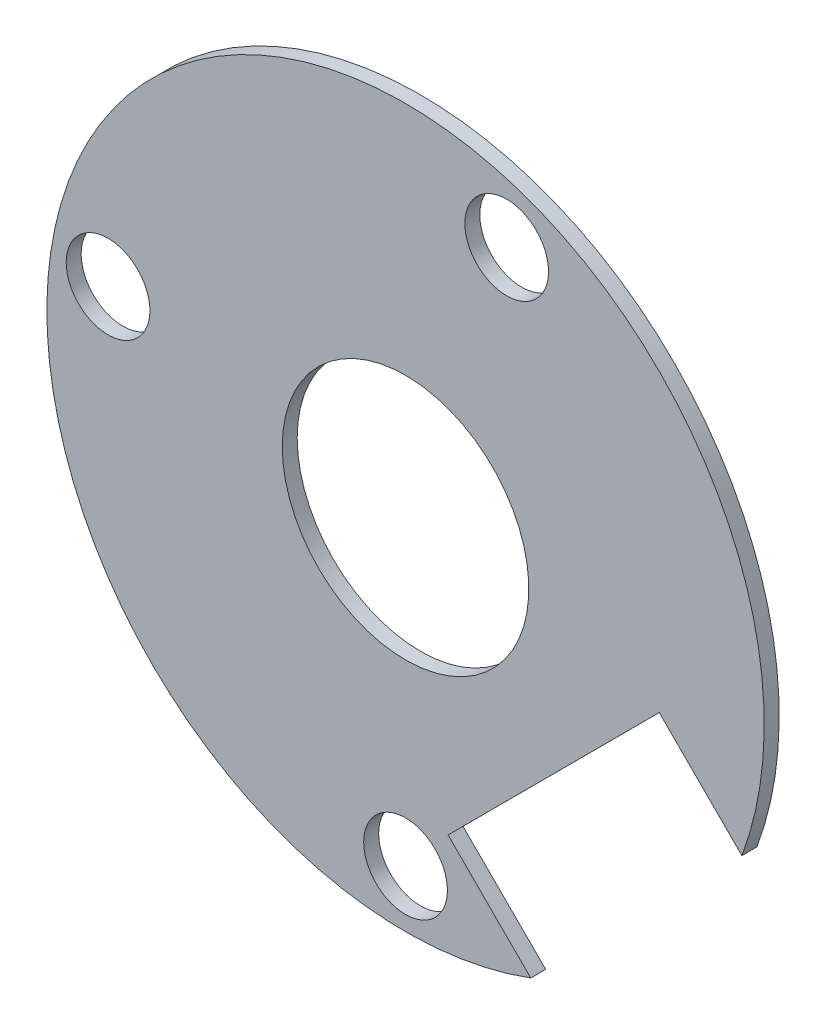
ISO-10303-21;
HEADER;
FILE_DESCRIPTION(('STEP AP214'),'2;1');
FILE_NAME('part.step','',(''),(''),'','','');
FILE_SCHEMA(('AUTOMOTIVE_DESIGN { 1 0 10303 214 1 1 1 1 }'));
ENDSEC;
DATA;
#1=APPLICATION_CONTEXT('core data for automotive mechanical design processes');
#2=APPLICATION_PROTOCOL_DEFINITION('international standard','automotive_design',2000,#1);
#3=PRODUCT_CONTEXT('',#1,'mechanical');
#4=PRODUCT('Part','Part','',(#3));
#5=PRODUCT_RELATED_PRODUCT_CATEGORY('part','',(#4));
#6=PRODUCT_DEFINITION_FORMATION('','',#4);
#7=PRODUCT_DEFINITION_CONTEXT('part definition',#1,'design');
#8=PRODUCT_DEFINITION('design','',#6,#7);
#9=PRODUCT_DEFINITION_SHAPE('','',#8);
#10=(LENGTH_UNIT() NAMED_UNIT(*) SI_UNIT(.MILLI.,.METRE.));
#11=(NAMED_UNIT(*) PLANE_ANGLE_UNIT() SI_UNIT($,.RADIAN.));
#12=(NAMED_UNIT(*) SI_UNIT($,.STERADIAN.) SOLID_ANGLE_UNIT());
#13=UNCERTAINTY_MEASURE_WITH_UNIT(LENGTH_MEASURE(1.E-05),#10,'distance_accuracy_value','');
#14=(GEOMETRIC_REPRESENTATION_CONTEXT(3) GLOBAL_UNCERTAINTY_ASSIGNED_CONTEXT((#13)) GLOBAL_UNIT_ASSIGNED_CONTEXT((#10,
#11,#12)) REPRESENTATION_CONTEXT('',''));
#15=CARTESIAN_POINT('',(0.,0.,0.));
#16=DIRECTION('',(0.,0.,1.));
#17=DIRECTION('',(1.,0.,0.));
#18=AXIS2_PLACEMENT_3D('',#15,#16,#17);
#19=CARTESIAN_POINT('',(0.,0.,76.));
#20=DIRECTION('',(0.,0.,1.));
#21=DIRECTION('',(0.,-1.,0.));
#22=AXIS2_PLACEMENT_3D('',#19,#20,#21);
#23=CYLINDRICAL_SURFACE('',#22,24.);
#24=DIRECTION('',(0.,0.,1.));
#25=VECTOR('',#24,1.);
#26=CARTESIAN_POINT('',(8.37808259667982,-22.4901696748426,76.));
#27=LINE('',#26,#25);
#28=CARTESIAN_POINT('',(8.37808259667982,-22.4901696748426,-108.));
#29=VERTEX_POINT('',#28);
#30=CARTESIAN_POINT('',(8.37808259667982,-22.4901696748426,-107.));
#31=VERTEX_POINT('',#30);
#32=EDGE_CURVE('E56',#29,#31,#27,.T.);
#33=ORIENTED_EDGE('',*,*,#32,.T.);
#34=CARTESIAN_POINT('',(0.,0.,-107.));
#35=DIRECTION('',(0.,0.,-1.));
#36=DIRECTION('',(-1.,0.,0.));
#37=AXIS2_PLACEMENT_3D('',#34,#35,#36);
#38=CIRCLE('',#37,24.);
#39=CARTESIAN_POINT('',(22.5064418611777,-8.33427109886813,-107.));
#40=VERTEX_POINT('',#39);
#41=EDGE_CURVE('E88',#31,#40,#38,.T.);
#42=ORIENTED_EDGE('',*,*,#41,.T.);
#43=DIRECTION('',(0.,0.,1.));
#44=VECTOR('',#43,1.);
#45=CARTESIAN_POINT('',(22.5064418611777,-8.33427109886813,76.));
#46=LINE('',#45,#44);
#47=CARTESIAN_POINT('',(22.5064418611777,-8.33427109886813,-108.));
#48=VERTEX_POINT('',#47);
#49=EDGE_CURVE('E87',#40,#48,#46,.F.);
#50=ORIENTED_EDGE('',*,*,#49,.T.);
#51=CARTESIAN_POINT('',(0.,0.,-108.));
#52=DIRECTION('',(0.,0.,1.));
#53=DIRECTION('',(0.,-1.,0.));
#54=AXIS2_PLACEMENT_3D('',#51,#52,#53);
#55=CIRCLE('',#54,24.);
#56=EDGE_CURVE('E41',#48,#29,#55,.T.);
#57=ORIENTED_EDGE('',*,*,#56,.T.);
#58=EDGE_LOOP('',(#33,#42,#50,#57));
#59=FACE_BOUND('',#58,.T.);
#60=ADVANCED_FACE('F33',(#59),#23,.T.);
#61=CARTESIAN_POINT('',(0.,24.,-108.));
#62=DIRECTION('',(0.,0.,1.));
#63=DIRECTION('',(0.,-1.,0.));
#64=AXIS2_PLACEMENT_3D('',#61,#62,#63);
#65=PLANE('',#64);
#66=CARTESIAN_POINT('',(0.,0.,-108.));
#67=DIRECTION('',(0.,0.,1.));
#68=DIRECTION('',(0.,-1.,0.));
#69=AXIS2_PLACEMENT_3D('',#66,#67,#68);
#70=CIRCLE('',#69,8.25000000000001);
#71=CARTESIAN_POINT('',(0.,-8.25,-108.));
#72=VERTEX_POINT('',#71);
#73=EDGE_CURVE('E113',#72,#72,#70,.T.);
#74=ORIENTED_EDGE('',*,*,#73,.T.);
#75=EDGE_LOOP('',(#74));
#76=FACE_BOUND('',#75,.T.);
#77=CARTESIAN_POINT('',(6.76785942282004,19.0325005932732,-108.));
#78=DIRECTION('',(0.,0.,1.));
#79=DIRECTION('',(1.,0.,0.));
#80=AXIS2_PLACEMENT_3D('',#77,#78,#79);
#81=CIRCLE('',#80,2.80000000000006);
#82=CARTESIAN_POINT('',(3.96785942281998,19.0325005932732,-108.));
#83=VERTEX_POINT('',#82);
#84=EDGE_CURVE('E104',#83,#83,#81,.T.);
#85=ORIENTED_EDGE('',*,*,#84,.T.);
#86=EDGE_LOOP('',(#85));
#87=FACE_BOUND('',#86,.T.);
#88=CARTESIAN_POINT('',(-19.9059854313234,3.43391089108909,-108.));
#89=DIRECTION('',(0.,0.,1.));
#90=DIRECTION('',(1.,0.,0.));
#91=AXIS2_PLACEMENT_3D('',#88,#89,#90);
#92=CIRCLE('',#91,2.80000000000001);
#93=CARTESIAN_POINT('',(-22.7059854313234,3.43391089108909,-108.));
#94=VERTEX_POINT('',#93);
#95=EDGE_CURVE('E107',#94,#94,#92,.T.);
#96=ORIENTED_EDGE('',*,*,#95,.T.);
#97=EDGE_LOOP('',(#96));
#98=FACE_BOUND('',#97,.T.);
#99=CARTESIAN_POINT('',(0.,-20.2,-108.));
#100=DIRECTION('',(0.,0.,1.));
#101=DIRECTION('',(1.,0.,0.));
#102=AXIS2_PLACEMENT_3D('',#99,#100,#101);
#103=CIRCLE('',#102,2.8);
#104=CARTESIAN_POINT('',(-2.8,-20.2,-108.));
#105=VERTEX_POINT('',#104);
#106=EDGE_CURVE('E103',#105,#105,#103,.T.);
#107=ORIENTED_EDGE('',*,*,#106,.T.);
#108=EDGE_LOOP('',(#107));
#109=FACE_BOUND('',#108,.T.);
#110=ORIENTED_EDGE('',*,*,#56,.F.);
#111=DIRECTION('',(0.707794928798725,-0.706417963224895,0.));
#112=VECTOR('',#111,1.);
#113=CARTESIAN_POINT('',(22.5064418611777,-8.33427109886812,-108.));
#114=LINE('',#113,#112);
#115=CARTESIAN_POINT('',(16.9733086354311,-2.81190219716126,-108.));
#116=VERTEX_POINT('',#115);
#117=EDGE_CURVE('E97',#116,#48,#114,.T.);
#118=ORIENTED_EDGE('',*,*,#117,.F.);
#119=DIRECTION('',(0.706417963224894,0.707794928798725,0.));
#120=VECTOR('',#119,1.);
#121=CARTESIAN_POINT('',(16.9733086354311,-2.81190219716126,-108.));
#122=LINE('',#121,#120);
#123=CARTESIAN_POINT('',(2.84494937093321,-16.9678007731358,-108.));
#124=VERTEX_POINT('',#123);
#125=EDGE_CURVE('E92',#124,#116,#122,.T.);
#126=ORIENTED_EDGE('',*,*,#125,.F.);
#127=DIRECTION('',(0.707794928798726,-0.706417963224893,0.));
#128=VECTOR('',#127,1.);
#129=CARTESIAN_POINT('',(-19.0641568798386,4.8986828424161,-108.));
#130=LINE('',#129,#128);
#131=EDGE_CURVE('E11',#124,#29,#130,.T.);
#132=ORIENTED_EDGE('',*,*,#131,.T.);
#133=EDGE_LOOP('',(#110,#118,#126,#132));
#134=FACE_BOUND('',#133,.T.);
#135=ADVANCED_FACE('F134',(#76,#87,#98,#109,#134),#65,.F.);
#136=CARTESIAN_POINT('',(0.,-20.2,-104.75));
#137=DIRECTION('',(0.,0.,-1.));
#138=DIRECTION('',(-1.,0.,0.));
#139=AXIS2_PLACEMENT_3D('',#136,#137,#138);
#140=CYLINDRICAL_SURFACE('',#139,2.8);
#141=CARTESIAN_POINT('',(0.,-20.2,-107.));
#142=DIRECTION('',(0.,0.,-1.));
#143=DIRECTION('',(-1.,0.,0.));
#144=AXIS2_PLACEMENT_3D('',#141,#142,#143);
#145=CIRCLE('',#144,2.8);
#146=CARTESIAN_POINT('',(-2.8,-20.2,-107.));
#147=VERTEX_POINT('',#146);
#148=EDGE_CURVE('E115',#147,#147,#145,.T.);
#149=CARTESIAN_POINT('',(-2.8,-20.2,-107.));
#150=CARTESIAN_POINT('',(-2.8,-20.2,-107.010416666667));
#151=CARTESIAN_POINT('',(-2.8,-20.2,-107.020833333333));
#152=CARTESIAN_POINT('',(-2.8,-20.2,-107.041666666667));
#153=CARTESIAN_POINT('',(-2.8,-20.2,-107.052083333333));
#154=CARTESIAN_POINT('',(-2.8,-20.2,-107.072916666667));
#155=CARTESIAN_POINT('',(-2.8,-20.2,-107.083333333333));
#156=CARTESIAN_POINT('',(-2.8,-20.2,-107.104166666667));
#157=CARTESIAN_POINT('',(-2.8,-20.2,-107.114583333333));
#158=CARTESIAN_POINT('',(-2.8,-20.2,-107.135416666667));
#159=CARTESIAN_POINT('',(-2.8,-20.2,-107.145833333333));
#160=CARTESIAN_POINT('',(-2.8,-20.2,-107.166666666667));
#161=CARTESIAN_POINT('',(-2.8,-20.2,-107.177083333333));
#162=CARTESIAN_POINT('',(-2.8,-20.2,-107.197916666667));
#163=CARTESIAN_POINT('',(-2.8,-20.2,-107.208333333333));
#164=CARTESIAN_POINT('',(-2.8,-20.2,-107.229166666667));
#165=CARTESIAN_POINT('',(-2.8,-20.2,-107.239583333333));
#166=CARTESIAN_POINT('',(-2.8,-20.2,-107.260416666667));
#167=CARTESIAN_POINT('',(-2.8,-20.2,-107.270833333333));
#168=CARTESIAN_POINT('',(-2.8,-20.2,-107.291666666667));
#169=CARTESIAN_POINT('',(-2.8,-20.2,-107.302083333333));
#170=CARTESIAN_POINT('',(-2.8,-20.2,-107.322916666667));
#171=CARTESIAN_POINT('',(-2.8,-20.2,-107.333333333333));
#172=CARTESIAN_POINT('',(-2.8,-20.2,-107.354166666667));
#173=CARTESIAN_POINT('',(-2.8,-20.2,-107.364583333333));
#174=CARTESIAN_POINT('',(-2.8,-20.2,-107.385416666667));
#175=CARTESIAN_POINT('',(-2.8,-20.2,-107.395833333333));
#176=CARTESIAN_POINT('',(-2.8,-20.2,-107.416666666667));
#177=CARTESIAN_POINT('',(-2.8,-20.2,-107.427083333333));
#178=CARTESIAN_POINT('',(-2.8,-20.2,-107.447916666667));
#179=CARTESIAN_POINT('',(-2.8,-20.2,-107.458333333333));
#180=CARTESIAN_POINT('',(-2.8,-20.2,-107.479166666667));
#181=CARTESIAN_POINT('',(-2.8,-20.2,-107.489583333333));
#182=CARTESIAN_POINT('',(-2.8,-20.2,-107.510416666667));
#183=CARTESIAN_POINT('',(-2.8,-20.2,-107.520833333333));
#184=CARTESIAN_POINT('',(-2.8,-20.2,-107.541666666667));
#185=CARTESIAN_POINT('',(-2.8,-20.2,-107.552083333333));
#186=CARTESIAN_POINT('',(-2.8,-20.2,-107.572916666667));
#187=CARTESIAN_POINT('',(-2.8,-20.2,-107.583333333333));
#188=CARTESIAN_POINT('',(-2.8,-20.2,-107.604166666667));
#189=CARTESIAN_POINT('',(-2.8,-20.2,-107.614583333333));
#190=CARTESIAN_POINT('',(-2.8,-20.2,-107.635416666667));
#191=CARTESIAN_POINT('',(-2.8,-20.2,-107.645833333333));
#192=CARTESIAN_POINT('',(-2.8,-20.2,-107.666666666667));
#193=CARTESIAN_POINT('',(-2.8,-20.2,-107.677083333333));
#194=CARTESIAN_POINT('',(-2.8,-20.2,-107.697916666667));
#195=CARTESIAN_POINT('',(-2.8,-20.2,-107.708333333333));
#196=CARTESIAN_POINT('',(-2.8,-20.2,-107.729166666667));
#197=CARTESIAN_POINT('',(-2.8,-20.2,-107.739583333333));
#198=CARTESIAN_POINT('',(-2.8,-20.2,-107.760416666667));
#199=CARTESIAN_POINT('',(-2.8,-20.2,-107.770833333333));
#200=CARTESIAN_POINT('',(-2.8,-20.2,-107.791666666667));
#201=CARTESIAN_POINT('',(-2.8,-20.2,-107.802083333333));
#202=CARTESIAN_POINT('',(-2.8,-20.2,-107.822916666667));
#203=CARTESIAN_POINT('',(-2.8,-20.2,-107.833333333333));
#204=CARTESIAN_POINT('',(-2.8,-20.2,-107.854166666667));
#205=CARTESIAN_POINT('',(-2.8,-20.2,-107.864583333333));
#206=CARTESIAN_POINT('',(-2.8,-20.2,-107.885416666667));
#207=CARTESIAN_POINT('',(-2.8,-20.2,-107.895833333333));
#208=CARTESIAN_POINT('',(-2.8,-20.2,-107.916666666667));
#209=CARTESIAN_POINT('',(-2.8,-20.2,-107.927083333333));
#210=CARTESIAN_POINT('',(-2.8,-20.2,-107.947916666667));
#211=CARTESIAN_POINT('',(-2.8,-20.2,-107.958333333333));
#212=CARTESIAN_POINT('',(-2.8,-20.2,-107.979166666667));
#213=CARTESIAN_POINT('',(-2.8,-20.2,-107.989583333333));
#214=CARTESIAN_POINT('',(-2.8,-20.2,-108.));
#215=B_SPLINE_CURVE_WITH_KNOTS('',3,(#149,#150,#151,#152,#153,#154,#155,#156,#157,#158,#159,
#160,#161,#162,#163,#164,#165,#166,#167,#168,#169,#170,#171,#172,#173,#174,#175,#176,#177,#178,
#179,#180,#181,#182,#183,#184,#185,#186,#187,#188,#189,#190,#191,#192,#193,#194,#195,#196,#197,
#198,#199,#200,#201,#202,#203,#204,#205,#206,#207,#208,#209,#210,#211,#212,#213,#214),
.UNSPECIFIED.,.F.,.F.,(4,2,2,2,2,2,2,2,2,2,2,2,2,2,2,2,2,2,2,2,2,2,2,2,2,2,2,2,2,2,2,2,4),(0.,
0.0312500000000104,0.062500000000007,0.0937500000000174,0.125000000000014,0.156250000000011,
0.187500000000021,0.218750000000018,0.250000000000014,0.281250000000025,0.312500000000021,
0.343750000000018,0.375000000000028,0.406250000000025,0.437500000000021,0.468750000000032,
0.500000000000028,0.531250000000025,0.562500000000035,0.593750000000032,0.625000000000028,
0.656250000000039,0.687500000000035,0.718750000000032,0.750000000000042,0.781250000000039,
0.812500000000035,0.843750000000046,0.875000000000042,0.906250000000039,0.937500000000049,
0.968750000000046,1.00000000000006),.UNSPECIFIED.);
#216=EDGE_CURVE('BSEAM136',#147,#105,#215,.T.);
#217=ORIENTED_EDGE('',*,*,#148,.F.);
#218=ORIENTED_EDGE('',*,*,#106,.F.);
#219=ORIENTED_EDGE('',*,*,#216,.T.);
#220=ORIENTED_EDGE('',*,*,#216,.F.);
#221=EDGE_LOOP('',(#217,#219,#218,#220));
#222=FACE_BOUND('',#221,.T.);
#223=ADVANCED_FACE('F136',(#222),#140,.F.);
#224=CARTESIAN_POINT('',(-19.9059854313234,3.43391089108909,-104.75));
#225=DIRECTION('',(0.,0.,-1.));
#226=DIRECTION('',(-1.,0.,0.));
#227=AXIS2_PLACEMENT_3D('',#224,#225,#226);
#228=CYLINDRICAL_SURFACE('',#227,2.80000000000001);
#229=CARTESIAN_POINT('',(-19.9059854313234,3.43391089108909,-107.));
#230=DIRECTION('',(0.,0.,-1.));
#231=DIRECTION('',(-1.,0.,0.));
#232=AXIS2_PLACEMENT_3D('',#229,#230,#231);
#233=CIRCLE('',#232,2.80000000000001);
#234=CARTESIAN_POINT('',(-22.7059854313234,3.43391089108909,-107.));
#235=VERTEX_POINT('',#234);
#236=EDGE_CURVE('E119',#235,#235,#233,.T.);
#237=CARTESIAN_POINT('',(-22.7059854313234,3.43391089108909,-107.));
#238=CARTESIAN_POINT('',(-22.7059854313234,3.43391089108909,-107.010416666667));
#239=CARTESIAN_POINT('',(-22.7059854313234,3.43391089108909,-107.020833333333));
#240=CARTESIAN_POINT('',(-22.7059854313234,3.43391089108909,-107.041666666667));
#241=CARTESIAN_POINT('',(-22.7059854313234,3.43391089108909,-107.052083333333));
#242=CARTESIAN_POINT('',(-22.7059854313234,3.43391089108909,-107.072916666667));
#243=CARTESIAN_POINT('',(-22.7059854313234,3.43391089108909,-107.083333333333));
#244=CARTESIAN_POINT('',(-22.7059854313234,3.43391089108909,-107.104166666667));
#245=CARTESIAN_POINT('',(-22.7059854313234,3.43391089108909,-107.114583333333));
#246=CARTESIAN_POINT('',(-22.7059854313234,3.43391089108909,-107.135416666667));
#247=CARTESIAN_POINT('',(-22.7059854313234,3.43391089108909,-107.145833333333));
#248=CARTESIAN_POINT('',(-22.7059854313234,3.43391089108909,-107.166666666667));
#249=CARTESIAN_POINT('',(-22.7059854313234,3.43391089108909,-107.177083333333));
#250=CARTESIAN_POINT('',(-22.7059854313234,3.43391089108909,-107.197916666667));
#251=CARTESIAN_POINT('',(-22.7059854313234,3.43391089108909,-107.208333333333));
#252=CARTESIAN_POINT('',(-22.7059854313234,3.43391089108909,-107.229166666667));
#253=CARTESIAN_POINT('',(-22.7059854313234,3.43391089108909,-107.239583333333));
#254=CARTESIAN_POINT('',(-22.7059854313234,3.43391089108909,-107.260416666667));
#255=CARTESIAN_POINT('',(-22.7059854313234,3.43391089108909,-107.270833333333));
#256=CARTESIAN_POINT('',(-22.7059854313234,3.43391089108909,-107.291666666667));
#257=CARTESIAN_POINT('',(-22.7059854313234,3.43391089108909,-107.302083333333));
#258=CARTESIAN_POINT('',(-22.7059854313234,3.43391089108909,-107.322916666667));
#259=CARTESIAN_POINT('',(-22.7059854313234,3.43391089108909,-107.333333333333));
#260=CARTESIAN_POINT('',(-22.7059854313234,3.43391089108909,-107.354166666667));
#261=CARTESIAN_POINT('',(-22.7059854313234,3.43391089108909,-107.364583333333));
#262=CARTESIAN_POINT('',(-22.7059854313234,3.43391089108909,-107.385416666667));
#263=CARTESIAN_POINT('',(-22.7059854313234,3.43391089108909,-107.395833333333));
#264=CARTESIAN_POINT('',(-22.7059854313234,3.43391089108909,-107.416666666667));
#265=CARTESIAN_POINT('',(-22.7059854313234,3.43391089108909,-107.427083333333));
#266=CARTESIAN_POINT('',(-22.7059854313234,3.43391089108909,-107.447916666667));
#267=CARTESIAN_POINT('',(-22.7059854313234,3.43391089108909,-107.458333333333));
#268=CARTESIAN_POINT('',(-22.7059854313234,3.43391089108909,-107.479166666667));
#269=CARTESIAN_POINT('',(-22.7059854313234,3.43391089108909,-107.489583333333));
#270=CARTESIAN_POINT('',(-22.7059854313234,3.43391089108909,-107.510416666667));
#271=CARTESIAN_POINT('',(-22.7059854313234,3.43391089108909,-107.520833333333));
#272=CARTESIAN_POINT('',(-22.7059854313234,3.43391089108909,-107.541666666667));
#273=CARTESIAN_POINT('',(-22.7059854313234,3.43391089108909,-107.552083333333));
#274=CARTESIAN_POINT('',(-22.7059854313234,3.43391089108909,-107.572916666667));
#275=CARTESIAN_POINT('',(-22.7059854313234,3.43391089108909,-107.583333333333));
#276=CARTESIAN_POINT('',(-22.7059854313234,3.43391089108909,-107.604166666667));
#277=CARTESIAN_POINT('',(-22.7059854313234,3.43391089108909,-107.614583333333));
#278=CARTESIAN_POINT('',(-22.7059854313234,3.43391089108909,-107.635416666667));
#279=CARTESIAN_POINT('',(-22.7059854313234,3.43391089108909,-107.645833333333));
#280=CARTESIAN_POINT('',(-22.7059854313234,3.43391089108909,-107.666666666667));
#281=CARTESIAN_POINT('',(-22.7059854313234,3.43391089108909,-107.677083333333));
#282=CARTESIAN_POINT('',(-22.7059854313234,3.43391089108909,-107.697916666667));
#283=CARTESIAN_POINT('',(-22.7059854313234,3.43391089108909,-107.708333333333));
#284=CARTESIAN_POINT('',(-22.7059854313234,3.43391089108909,-107.729166666667));
#285=CARTESIAN_POINT('',(-22.7059854313234,3.43391089108909,-107.739583333333));
#286=CARTESIAN_POINT('',(-22.7059854313234,3.43391089108909,-107.760416666667));
#287=CARTESIAN_POINT('',(-22.7059854313234,3.43391089108909,-107.770833333333));
#288=CARTESIAN_POINT('',(-22.7059854313234,3.43391089108909,-107.791666666667));
#289=CARTESIAN_POINT('',(-22.7059854313234,3.43391089108909,-107.802083333333));
#290=CARTESIAN_POINT('',(-22.7059854313234,3.43391089108909,-107.822916666667));
#291=CARTESIAN_POINT('',(-22.7059854313234,3.43391089108909,-107.833333333333));
#292=CARTESIAN_POINT('',(-22.7059854313234,3.43391089108909,-107.854166666667));
#293=CARTESIAN_POINT('',(-22.7059854313234,3.43391089108909,-107.864583333333));
#294=CARTESIAN_POINT('',(-22.7059854313234,3.43391089108909,-107.885416666667));
#295=CARTESIAN_POINT('',(-22.7059854313234,3.43391089108909,-107.895833333333));
#296=CARTESIAN_POINT('',(-22.7059854313234,3.43391089108909,-107.916666666667));
#297=CARTESIAN_POINT('',(-22.7059854313234,3.43391089108909,-107.927083333333));
#298=CARTESIAN_POINT('',(-22.7059854313234,3.43391089108909,-107.947916666667));
#299=CARTESIAN_POINT('',(-22.7059854313234,3.43391089108909,-107.958333333333));
#300=CARTESIAN_POINT('',(-22.7059854313234,3.43391089108909,-107.979166666667));
#301=CARTESIAN_POINT('',(-22.7059854313234,3.43391089108909,-107.989583333333));
#302=CARTESIAN_POINT('',(-22.7059854313234,3.43391089108909,-108.));
#303=B_SPLINE_CURVE_WITH_KNOTS('',3,(#237,#238,#239,#240,#241,#242,#243,#244,#245,#246,#247,
#248,#249,#250,#251,#252,#253,#254,#255,#256,#257,#258,#259,#260,#261,#262,#263,#264,#265,#266,
#267,#268,#269,#270,#271,#272,#273,#274,#275,#276,#277,#278,#279,#280,#281,#282,#283,#284,#285,
#286,#287,#288,#289,#290,#291,#292,#293,#294,#295,#296,#297,#298,#299,#300,#301,#302),
.UNSPECIFIED.,.F.,.F.,(4,2,2,2,2,2,2,2,2,2,2,2,2,2,2,2,2,2,2,2,2,2,2,2,2,2,2,2,2,2,2,2,4),(0.,
0.0312499999999966,0.0624999999999931,0.0937500000000036,0.125,0.156249999999997,
0.187500000000007,0.218750000000004,0.250000000000014,0.281250000000011,0.312500000000007,
0.343750000000018,0.375000000000014,0.406250000000011,0.437500000000021,0.468750000000018,
0.500000000000028,0.531250000000025,0.562500000000021,0.593750000000032,0.625000000000028,
0.656250000000025,0.687500000000035,0.718750000000032,0.750000000000042,0.781250000000039,
0.812500000000035,0.843750000000046,0.875000000000042,0.906250000000039,0.937500000000049,
0.968750000000046,1.00000000000006),.UNSPECIFIED.);
#304=EDGE_CURVE('BSEAM141',#235,#94,#303,.T.);
#305=ORIENTED_EDGE('',*,*,#236,.F.);
#306=ORIENTED_EDGE('',*,*,#95,.F.);
#307=ORIENTED_EDGE('',*,*,#304,.T.);
#308=ORIENTED_EDGE('',*,*,#304,.F.);
#309=EDGE_LOOP('',(#305,#307,#306,#308));
#310=FACE_BOUND('',#309,.T.);
#311=ADVANCED_FACE('F141',(#310),#228,.F.);
#312=CARTESIAN_POINT('',(6.76785942282004,19.0325005932732,-104.75));
#313=DIRECTION('',(0.,0.,-1.));
#314=DIRECTION('',(-1.,0.,0.));
#315=AXIS2_PLACEMENT_3D('',#312,#313,#314);
#316=CYLINDRICAL_SURFACE('',#315,2.80000000000006);
#317=CARTESIAN_POINT('',(6.76785942282004,19.0325005932732,-107.));
#318=DIRECTION('',(0.,0.,-1.));
#319=DIRECTION('',(-1.,0.,0.));
#320=AXIS2_PLACEMENT_3D('',#317,#318,#319);
#321=CIRCLE('',#320,2.80000000000006);
#322=CARTESIAN_POINT('',(3.96785942281998,19.0325005932732,-107.));
#323=VERTEX_POINT('',#322);
#324=EDGE_CURVE('E124',#323,#323,#321,.T.);
#325=CARTESIAN_POINT('',(3.96785942281998,19.0325005932732,-107.));
#326=CARTESIAN_POINT('',(3.96785942281998,19.0325005932732,-107.010416666667));
#327=CARTESIAN_POINT('',(3.96785942281998,19.0325005932732,-107.020833333333));
#328=CARTESIAN_POINT('',(3.96785942281998,19.0325005932732,-107.041666666667));
#329=CARTESIAN_POINT('',(3.96785942281998,19.0325005932732,-107.052083333333));
#330=CARTESIAN_POINT('',(3.96785942281998,19.0325005932732,-107.072916666667));
#331=CARTESIAN_POINT('',(3.96785942281998,19.0325005932732,-107.083333333333));
#332=CARTESIAN_POINT('',(3.96785942281998,19.0325005932732,-107.104166666667));
#333=CARTESIAN_POINT('',(3.96785942281998,19.0325005932732,-107.114583333333));
#334=CARTESIAN_POINT('',(3.96785942281998,19.0325005932732,-107.135416666667));
#335=CARTESIAN_POINT('',(3.96785942281998,19.0325005932732,-107.145833333333));
#336=CARTESIAN_POINT('',(3.96785942281998,19.0325005932732,-107.166666666667));
#337=CARTESIAN_POINT('',(3.96785942281998,19.0325005932732,-107.177083333333));
#338=CARTESIAN_POINT('',(3.96785942281998,19.0325005932732,-107.197916666667));
#339=CARTESIAN_POINT('',(3.96785942281998,19.0325005932732,-107.208333333333));
#340=CARTESIAN_POINT('',(3.96785942281998,19.0325005932732,-107.229166666667));
#341=CARTESIAN_POINT('',(3.96785942281998,19.0325005932732,-107.239583333333));
#342=CARTESIAN_POINT('',(3.96785942281998,19.0325005932732,-107.260416666667));
#343=CARTESIAN_POINT('',(3.96785942281998,19.0325005932732,-107.270833333333));
#344=CARTESIAN_POINT('',(3.96785942281998,19.0325005932732,-107.291666666667));
#345=CARTESIAN_POINT('',(3.96785942281998,19.0325005932732,-107.302083333333));
#346=CARTESIAN_POINT('',(3.96785942281998,19.0325005932732,-107.322916666667));
#347=CARTESIAN_POINT('',(3.96785942281998,19.0325005932732,-107.333333333333));
#348=CARTESIAN_POINT('',(3.96785942281998,19.0325005932732,-107.354166666667));
#349=CARTESIAN_POINT('',(3.96785942281998,19.0325005932732,-107.364583333333));
#350=CARTESIAN_POINT('',(3.96785942281998,19.0325005932732,-107.385416666667));
#351=CARTESIAN_POINT('',(3.96785942281998,19.0325005932732,-107.395833333333));
#352=CARTESIAN_POINT('',(3.96785942281998,19.0325005932732,-107.416666666667));
#353=CARTESIAN_POINT('',(3.96785942281998,19.0325005932732,-107.427083333333));
#354=CARTESIAN_POINT('',(3.96785942281998,19.0325005932732,-107.447916666667));
#355=CARTESIAN_POINT('',(3.96785942281998,19.0325005932732,-107.458333333333));
#356=CARTESIAN_POINT('',(3.96785942281998,19.0325005932732,-107.479166666667));
#357=CARTESIAN_POINT('',(3.96785942281998,19.0325005932732,-107.489583333333));
#358=CARTESIAN_POINT('',(3.96785942281998,19.0325005932732,-107.510416666667));
#359=CARTESIAN_POINT('',(3.96785942281998,19.0325005932732,-107.520833333333));
#360=CARTESIAN_POINT('',(3.96785942281998,19.0325005932732,-107.541666666667));
#361=CARTESIAN_POINT('',(3.96785942281998,19.0325005932732,-107.552083333333));
#362=CARTESIAN_POINT('',(3.96785942281998,19.0325005932732,-107.572916666667));
#363=CARTESIAN_POINT('',(3.96785942281998,19.0325005932732,-107.583333333333));
#364=CARTESIAN_POINT('',(3.96785942281998,19.0325005932732,-107.604166666667));
#365=CARTESIAN_POINT('',(3.96785942281998,19.0325005932732,-107.614583333333));
#366=CARTESIAN_POINT('',(3.96785942281998,19.0325005932732,-107.635416666667));
#367=CARTESIAN_POINT('',(3.96785942281998,19.0325005932732,-107.645833333333));
#368=CARTESIAN_POINT('',(3.96785942281998,19.0325005932732,-107.666666666667));
#369=CARTESIAN_POINT('',(3.96785942281998,19.0325005932732,-107.677083333333));
#370=CARTESIAN_POINT('',(3.96785942281998,19.0325005932732,-107.697916666667));
#371=CARTESIAN_POINT('',(3.96785942281998,19.0325005932732,-107.708333333333));
#372=CARTESIAN_POINT('',(3.96785942281998,19.0325005932732,-107.729166666667));
#373=CARTESIAN_POINT('',(3.96785942281998,19.0325005932732,-107.739583333333));
#374=CARTESIAN_POINT('',(3.96785942281998,19.0325005932732,-107.760416666667));
#375=CARTESIAN_POINT('',(3.96785942281998,19.0325005932732,-107.770833333333));
#376=CARTESIAN_POINT('',(3.96785942281998,19.0325005932732,-107.791666666667));
#377=CARTESIAN_POINT('',(3.96785942281998,19.0325005932732,-107.802083333333));
#378=CARTESIAN_POINT('',(3.96785942281998,19.0325005932732,-107.822916666667));
#379=CARTESIAN_POINT('',(3.96785942281998,19.0325005932732,-107.833333333333));
#380=CARTESIAN_POINT('',(3.96785942281998,19.0325005932732,-107.854166666667));
#381=CARTESIAN_POINT('',(3.96785942281998,19.0325005932732,-107.864583333333));
#382=CARTESIAN_POINT('',(3.96785942281998,19.0325005932732,-107.885416666667));
#383=CARTESIAN_POINT('',(3.96785942281998,19.0325005932732,-107.895833333333));
#384=CARTESIAN_POINT('',(3.96785942281998,19.0325005932732,-107.916666666667));
#385=CARTESIAN_POINT('',(3.96785942281998,19.0325005932732,-107.927083333333));
#386=CARTESIAN_POINT('',(3.96785942281998,19.0325005932732,-107.947916666667));
#387=CARTESIAN_POINT('',(3.96785942281998,19.0325005932732,-107.958333333333));
#388=CARTESIAN_POINT('',(3.96785942281998,19.0325005932732,-107.979166666667));
#389=CARTESIAN_POINT('',(3.96785942281998,19.0325005932732,-107.989583333333));
#390=CARTESIAN_POINT('',(3.96785942281998,19.0325005932732,-108.));
#391=B_SPLINE_CURVE_WITH_KNOTS('',3,(#325,#326,#327,#328,#329,#330,#331,#332,#333,#334,#335,
#336,#337,#338,#339,#340,#341,#342,#343,#344,#345,#346,#347,#348,#349,#350,#351,#352,#353,#354,
#355,#356,#357,#358,#359,#360,#361,#362,#363,#364,#365,#366,#367,#368,#369,#370,#371,#372,#373,
#374,#375,#376,#377,#378,#379,#380,#381,#382,#383,#384,#385,#386,#387,#388,#389,#390),
.UNSPECIFIED.,.F.,.F.,(4,2,2,2,2,2,2,2,2,2,2,2,2,2,2,2,2,2,2,2,2,2,2,2,2,2,2,2,2,2,2,2,4),(0.,
0.0312500000000104,0.062500000000007,0.0937500000000174,0.125000000000014,0.156250000000011,
0.187500000000021,0.218750000000018,0.250000000000014,0.281250000000025,0.312500000000021,
0.343750000000018,0.375000000000028,0.406250000000025,0.437500000000021,0.468750000000032,
0.500000000000028,0.531250000000025,0.562500000000035,0.593750000000032,0.625000000000028,
0.656250000000039,0.687500000000035,0.718750000000032,0.750000000000042,0.781250000000039,
0.812500000000035,0.843750000000046,0.875000000000042,0.906250000000039,0.937500000000049,
0.968750000000046,1.00000000000006),.UNSPECIFIED.);
#392=EDGE_CURVE('BSEAM148',#323,#83,#391,.T.);
#393=ORIENTED_EDGE('',*,*,#324,.F.);
#394=ORIENTED_EDGE('',*,*,#84,.F.);
#395=ORIENTED_EDGE('',*,*,#392,.T.);
#396=ORIENTED_EDGE('',*,*,#392,.F.);
#397=EDGE_LOOP('',(#393,#395,#394,#396));
#398=FACE_BOUND('',#397,.T.);
#399=ADVANCED_FACE('F148',(#398),#316,.F.);
#400=CARTESIAN_POINT('',(22.5064418611777,-8.33427109886812,-106.));
#401=DIRECTION('',(0.706417963224895,0.707794928798725,0.));
#402=DIRECTION('',(-0.707794928798725,0.706417963224895,0.));
#403=AXIS2_PLACEMENT_3D('',#400,#401,#402);
#404=PLANE('',#403);
#405=ORIENTED_EDGE('',*,*,#49,.F.);
#406=DIRECTION('',(-0.707794928798725,0.706417963224895,0.));
#407=VECTOR('',#406,1.);
#408=CARTESIAN_POINT('',(22.5064418611777,-8.33427109886812,-107.));
#409=LINE('',#408,#407);
#410=CARTESIAN_POINT('',(16.9733086354311,-2.81190219716126,-107.));
#411=VERTEX_POINT('',#410);
#412=EDGE_CURVE('E75',#40,#411,#409,.T.);
#413=ORIENTED_EDGE('',*,*,#412,.T.);
#414=DIRECTION('',(0.,0.,-1.));
#415=VECTOR('',#414,1.);
#416=CARTESIAN_POINT('',(16.9733086354311,-2.81190219716126,-106.));
#417=LINE('',#416,#415);
#418=EDGE_CURVE('E85',#411,#116,#417,.T.);
#419=ORIENTED_EDGE('',*,*,#418,.T.);
#420=ORIENTED_EDGE('',*,*,#117,.T.);
#421=EDGE_LOOP('',(#405,#413,#419,#420));
#422=FACE_BOUND('',#421,.T.);
#423=ADVANCED_FACE('F83',(#422),#404,.F.);
#424=CARTESIAN_POINT('',(2.84494937093321,-16.9678007731358,-106.));
#425=DIRECTION('',(-0.706417963224893,-0.707794928798726,0.));
#426=DIRECTION('',(0.707794928798726,-0.706417963224893,0.));
#427=AXIS2_PLACEMENT_3D('',#424,#425,#426);
#428=PLANE('',#427);
#429=DIRECTION('',(0.,0.,-1.));
#430=VECTOR('',#429,1.);
#431=CARTESIAN_POINT('',(2.84494937093321,-16.9678007731358,-106.));
#432=LINE('',#431,#430);
#433=CARTESIAN_POINT('',(2.84494937093321,-16.9678007731358,-107.));
#434=VERTEX_POINT('',#433);
#435=EDGE_CURVE('E94',#434,#124,#432,.T.);
#436=ORIENTED_EDGE('',*,*,#435,.F.);
#437=DIRECTION('',(0.707794928798726,-0.706417963224893,0.));
#438=VECTOR('',#437,1.);
#439=CARTESIAN_POINT('',(2.84494937093321,-16.9678007731358,-107.));
#440=LINE('',#439,#438);
#441=EDGE_CURVE('E49',#434,#31,#440,.T.);
#442=ORIENTED_EDGE('',*,*,#441,.T.);
#443=ORIENTED_EDGE('',*,*,#32,.F.);
#444=ORIENTED_EDGE('',*,*,#131,.F.);
#445=EDGE_LOOP('',(#436,#442,#443,#444));
#446=FACE_BOUND('',#445,.T.);
#447=ADVANCED_FACE('F130',(#446),#428,.F.);
#448=CARTESIAN_POINT('',(16.9733086354311,-2.81190219716126,-106.));
#449=DIRECTION('',(-0.707794928798725,0.706417963224894,0.));
#450=DIRECTION('',(-0.706417963224894,-0.707794928798725,0.));
#451=AXIS2_PLACEMENT_3D('',#448,#449,#450);
#452=PLANE('',#451);
#453=ORIENTED_EDGE('',*,*,#418,.F.);
#454=DIRECTION('',(-0.706417963224894,-0.707794928798725,0.));
#455=VECTOR('',#454,1.);
#456=CARTESIAN_POINT('',(16.9733086354311,-2.81190219716126,-107.));
#457=LINE('',#456,#455);
#458=EDGE_CURVE('E72',#411,#434,#457,.T.);
#459=ORIENTED_EDGE('',*,*,#458,.T.);
#460=ORIENTED_EDGE('',*,*,#435,.T.);
#461=ORIENTED_EDGE('',*,*,#125,.T.);
#462=EDGE_LOOP('',(#453,#459,#460,#461));
#463=FACE_BOUND('',#462,.T.);
#464=ADVANCED_FACE('F90',(#463),#452,.F.);
#465=CARTESIAN_POINT('',(0.,0.,76.));
#466=DIRECTION('',(0.,0.,-1.));
#467=DIRECTION('',(0.,1.,0.));
#468=AXIS2_PLACEMENT_3D('',#465,#466,#467);
#469=CYLINDRICAL_SURFACE('',#468,8.25000000000001);
#470=CARTESIAN_POINT('',(0.,0.,-107.));
#471=DIRECTION('',(0.,0.,-1.));
#472=DIRECTION('',(-1.,0.,0.));
#473=AXIS2_PLACEMENT_3D('',#470,#471,#472);
#474=CIRCLE('',#473,8.25000000000001);
#475=CARTESIAN_POINT('',(-8.25000000000001,0.,-107.));
#476=VERTEX_POINT('',#475);
#477=EDGE_CURVE('E36',#476,#476,#474,.F.);
#478=ORIENTED_EDGE('',*,*,#477,.T.);
#479=EDGE_LOOP('',(#478));
#480=FACE_BOUND('',#479,.T.);
#481=ORIENTED_EDGE('',*,*,#73,.F.);
#482=EDGE_LOOP('',(#481));
#483=FACE_BOUND('',#482,.T.);
#484=ADVANCED_FACE('F157',(#480,#483),#469,.F.);
#485=CARTESIAN_POINT('',(37.6623177451338,-26.,-107.));
#486=DIRECTION('',(0.,0.,-1.));
#487=DIRECTION('',(-1.,0.,0.));
#488=AXIS2_PLACEMENT_3D('',#485,#486,#487);
#489=PLANE('',#488);
#490=ORIENTED_EDGE('',*,*,#148,.T.);
#491=EDGE_LOOP('',(#490));
#492=FACE_BOUND('',#491,.T.);
#493=ORIENTED_EDGE('',*,*,#236,.T.);
#494=EDGE_LOOP('',(#493));
#495=FACE_BOUND('',#494,.T.);
#496=ORIENTED_EDGE('',*,*,#324,.T.);
#497=EDGE_LOOP('',(#496));
#498=FACE_BOUND('',#497,.T.);
#499=ORIENTED_EDGE('',*,*,#477,.F.);
#500=EDGE_LOOP('',(#499));
#501=FACE_BOUND('',#500,.T.);
#502=ORIENTED_EDGE('',*,*,#441,.F.);
#503=ORIENTED_EDGE('',*,*,#458,.F.);
#504=ORIENTED_EDGE('',*,*,#412,.F.);
#505=ORIENTED_EDGE('',*,*,#41,.F.);
#506=EDGE_LOOP('',(#502,#503,#504,#505));
#507=FACE_BOUND('',#506,.T.);
#508=ADVANCED_FACE('F74',(#492,#495,#498,#501,#507),#489,.F.);
#509=CLOSED_SHELL('',(#60,#135,#223,#311,#399,#423,#447,#464,#484,#508));
#510=MANIFOLD_SOLID_BREP('B2',#509);
#511=ADVANCED_BREP_SHAPE_REPRESENTATION('',(#18,#510),#14);
#512=SHAPE_DEFINITION_REPRESENTATION(#9,#511);
ENDSEC;
END-ISO-10303-21;
